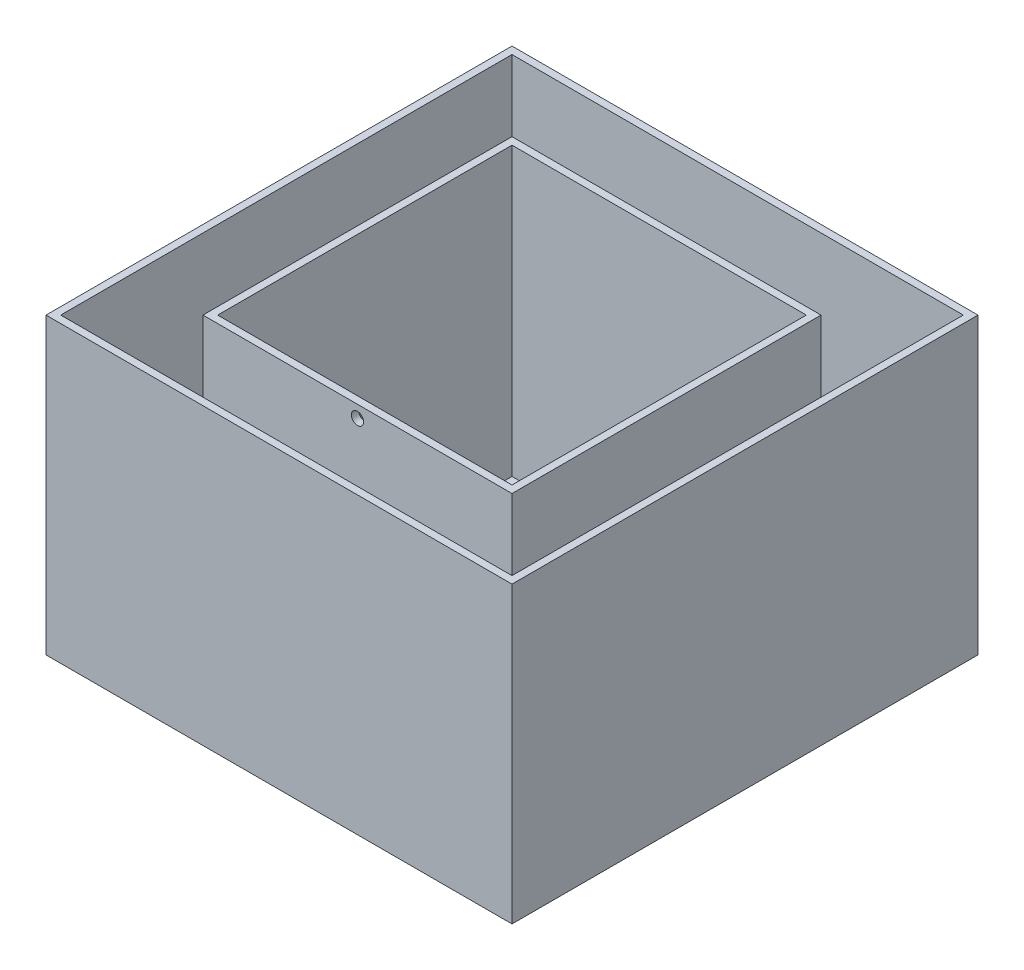
ISO-10303-21;
HEADER;
FILE_DESCRIPTION(('STEP AP214'),'2;1');
FILE_NAME('part.step','',(''),(''),'','','');
FILE_SCHEMA(('AUTOMOTIVE_DESIGN { 1 0 10303 214 1 1 1 1 }'));
ENDSEC;
DATA;
#1=APPLICATION_CONTEXT('core data for automotive mechanical design processes');
#2=APPLICATION_PROTOCOL_DEFINITION('international standard','automotive_design',2000,#1);
#3=PRODUCT_CONTEXT('',#1,'mechanical');
#4=PRODUCT('Part','Part','',(#3));
#5=PRODUCT_RELATED_PRODUCT_CATEGORY('part','',(#4));
#6=PRODUCT_DEFINITION_FORMATION('','',#4);
#7=PRODUCT_DEFINITION_CONTEXT('part definition',#1,'design');
#8=PRODUCT_DEFINITION('design','',#6,#7);
#9=PRODUCT_DEFINITION_SHAPE('','',#8);
#10=(LENGTH_UNIT() NAMED_UNIT(*) SI_UNIT(.MILLI.,.METRE.));
#11=(NAMED_UNIT(*) PLANE_ANGLE_UNIT() SI_UNIT($,.RADIAN.));
#12=(NAMED_UNIT(*) SI_UNIT($,.STERADIAN.) SOLID_ANGLE_UNIT());
#13=UNCERTAINTY_MEASURE_WITH_UNIT(LENGTH_MEASURE(1.E-05),#10,'distance_accuracy_value','');
#14=(GEOMETRIC_REPRESENTATION_CONTEXT(3) GLOBAL_UNCERTAINTY_ASSIGNED_CONTEXT((#13)) GLOBAL_UNIT_ASSIGNED_CONTEXT((#10,
#11,#12)) REPRESENTATION_CONTEXT('',''));
#15=CARTESIAN_POINT('',(0.,0.,0.));
#16=DIRECTION('',(0.,0.,1.));
#17=DIRECTION('',(1.,0.,0.));
#18=AXIS2_PLACEMENT_3D('',#15,#16,#17);
#19=CARTESIAN_POINT('',(0.,4.99999999999999,0.));
#20=DIRECTION('',(0.,-1.,0.));
#21=DIRECTION('',(0.,0.,-1.));
#22=AXIS2_PLACEMENT_3D('',#19,#20,#21);
#23=PLANE('',#22);
#24=DIRECTION('',(0.,0.,1.));
#25=VECTOR('',#24,1.);
#26=CARTESIAN_POINT('',(-92.,4.99999999999999,92.));
#27=LINE('',#26,#25);
#28=CARTESIAN_POINT('',(-92.,4.99999999999999,-92.));
#29=VERTEX_POINT('',#28);
#30=CARTESIAN_POINT('',(-92.,4.99999999999999,92.));
#31=VERTEX_POINT('',#30);
#32=EDGE_CURVE('E258',#29,#31,#27,.T.);
#33=ORIENTED_EDGE('',*,*,#32,.T.);
#34=DIRECTION('',(1.,0.,0.));
#35=VECTOR('',#34,1.);
#36=CARTESIAN_POINT('',(-92.,4.99999999999999,92.));
#37=LINE('',#36,#35);
#38=CARTESIAN_POINT('',(92.,4.99999999999999,92.));
#39=VERTEX_POINT('',#38);
#40=EDGE_CURVE('E261',#31,#39,#37,.T.);
#41=ORIENTED_EDGE('',*,*,#40,.T.);
#42=DIRECTION('',(0.,0.,-1.));
#43=VECTOR('',#42,1.);
#44=CARTESIAN_POINT('',(92.,4.99999999999999,92.));
#45=LINE('',#44,#43);
#46=CARTESIAN_POINT('',(92.,4.99999999999999,-92.));
#47=VERTEX_POINT('',#46);
#48=EDGE_CURVE('E265',#39,#47,#45,.T.);
#49=ORIENTED_EDGE('',*,*,#48,.T.);
#50=DIRECTION('',(-1.,0.,0.));
#51=VECTOR('',#50,1.);
#52=CARTESIAN_POINT('',(-92.,4.99999999999999,-92.));
#53=LINE('',#52,#51);
#54=EDGE_CURVE('E268',#47,#29,#53,.T.);
#55=ORIENTED_EDGE('',*,*,#54,.T.);
#56=EDGE_LOOP('',(#33,#41,#49,#55));
#57=FACE_BOUND('',#56,.T.);
#58=DIRECTION('',(-0.707106781186547,0.,0.707106781186548));
#59=VECTOR('',#58,1.);
#60=CARTESIAN_POINT('',(63.,4.99999999999999,-63.));
#61=LINE('',#60,#59);
#62=CARTESIAN_POINT('',(89.,4.99999999999999,-89.0000000000001));
#63=VERTEX_POINT('',#62);
#64=CARTESIAN_POINT('',(63.,4.99999999999999,-63.));
#65=VERTEX_POINT('',#64);
#66=EDGE_CURVE('E189',#63,#65,#61,.T.);
#67=ORIENTED_EDGE('',*,*,#66,.F.);
#68=DIRECTION('',(0.,0.,-1.));
#69=VECTOR('',#68,1.);
#70=CARTESIAN_POINT('',(89.0000000000001,4.99999999999999,89.0000000000009));
#71=LINE('',#70,#69);
#72=CARTESIAN_POINT('',(89.0000000000001,4.99999999999999,89.0000000000009));
#73=VERTEX_POINT('',#72);
#74=EDGE_CURVE('E198',#73,#63,#71,.T.);
#75=ORIENTED_EDGE('',*,*,#74,.F.);
#76=DIRECTION('',(0.707106781186535,0.,0.70710678118656));
#77=VECTOR('',#76,1.);
#78=CARTESIAN_POINT('',(89.0000000000001,4.99999999999999,89.0000000000009));
#79=LINE('',#78,#77);
#80=CARTESIAN_POINT('',(63.,4.99999999999999,63.));
#81=VERTEX_POINT('',#80);
#82=EDGE_CURVE('E195',#81,#73,#79,.T.);
#83=ORIENTED_EDGE('',*,*,#82,.F.);
#84=DIRECTION('',(1.,0.,0.));
#85=VECTOR('',#84,1.);
#86=CARTESIAN_POINT('',(-63.,4.99999999999999,63.));
#87=LINE('',#86,#85);
#88=CARTESIAN_POINT('',(-63.,4.99999999999999,63.));
#89=VERTEX_POINT('',#88);
#90=EDGE_CURVE('E234',#89,#81,#87,.T.);
#91=ORIENTED_EDGE('',*,*,#90,.F.);
#92=DIRECTION('',(0.707106781186535,0.,-0.70710678118656));
#93=VECTOR('',#92,1.);
#94=CARTESIAN_POINT('',(-89.,4.99999999999999,89.0000000000009));
#95=LINE('',#94,#93);
#96=CARTESIAN_POINT('',(-89.,4.99999999999999,89.0000000000009));
#97=VERTEX_POINT('',#96);
#98=EDGE_CURVE('E205',#97,#89,#95,.T.);
#99=ORIENTED_EDGE('',*,*,#98,.F.);
#100=DIRECTION('',(0.,0.,1.));
#101=VECTOR('',#100,1.);
#102=CARTESIAN_POINT('',(-89.,4.99999999999999,89.0000000000009));
#103=LINE('',#102,#101);
#104=CARTESIAN_POINT('',(-89.,4.99999999999999,-89.));
#105=VERTEX_POINT('',#104);
#106=EDGE_CURVE('E221',#105,#97,#103,.T.);
#107=ORIENTED_EDGE('',*,*,#106,.F.);
#108=DIRECTION('',(-0.707106781186547,0.,-0.707106781186548));
#109=VECTOR('',#108,1.);
#110=CARTESIAN_POINT('',(-63.,4.99999999999999,-63.));
#111=LINE('',#110,#109);
#112=CARTESIAN_POINT('',(-63.,4.99999999999999,-63.));
#113=VERTEX_POINT('',#112);
#114=EDGE_CURVE('E53',#113,#105,#111,.T.);
#115=ORIENTED_EDGE('',*,*,#114,.F.);
#116=DIRECTION('',(-1.,0.,0.));
#117=VECTOR('',#116,1.);
#118=CARTESIAN_POINT('',(-63.,4.99999999999999,-63.));
#119=LINE('',#118,#117);
#120=EDGE_CURVE('E209',#65,#113,#119,.T.);
#121=ORIENTED_EDGE('',*,*,#120,.F.);
#122=EDGE_LOOP('',(#67,#75,#83,#91,#99,#107,#115,#121));
#123=FACE_BOUND('',#122,.T.);
#124=ADVANCED_FACE('F37',(#57,#123),#23,.F.);
#125=CARTESIAN_POINT('',(-95.,120.,95.));
#126=DIRECTION('',(-1.,0.,0.));
#127=DIRECTION('',(0.,0.,1.));
#128=AXIS2_PLACEMENT_3D('',#125,#126,#127);
#129=PLANE('',#128);
#130=DIRECTION('',(0.,0.,-1.));
#131=VECTOR('',#130,1.);
#132=CARTESIAN_POINT('',(-95.,0.,95.));
#133=LINE('',#132,#131);
#134=CARTESIAN_POINT('',(-95.,0.,95.));
#135=VERTEX_POINT('',#134);
#136=CARTESIAN_POINT('',(-95.,0.,-95.));
#137=VERTEX_POINT('',#136);
#138=EDGE_CURVE('E315',#135,#137,#133,.T.);
#139=ORIENTED_EDGE('',*,*,#138,.F.);
#140=DIRECTION('',(0.,-1.,0.));
#141=VECTOR('',#140,1.);
#142=CARTESIAN_POINT('',(-95.,120.,95.));
#143=LINE('',#142,#141);
#144=CARTESIAN_POINT('',(-95.,120.,95.));
#145=VERTEX_POINT('',#144);
#146=EDGE_CURVE('E343',#145,#135,#143,.T.);
#147=ORIENTED_EDGE('',*,*,#146,.F.);
#148=DIRECTION('',(0.,0.,-1.));
#149=VECTOR('',#148,1.);
#150=CARTESIAN_POINT('',(-95.,120.,95.));
#151=LINE('',#150,#149);
#152=CARTESIAN_POINT('',(-95.,120.,-95.));
#153=VERTEX_POINT('',#152);
#154=EDGE_CURVE('E322',#145,#153,#151,.T.);
#155=ORIENTED_EDGE('',*,*,#154,.T.);
#156=DIRECTION('',(0.,-1.,0.));
#157=VECTOR('',#156,1.);
#158=CARTESIAN_POINT('',(-95.,120.,-95.));
#159=LINE('',#158,#157);
#160=EDGE_CURVE('E333',#153,#137,#159,.T.);
#161=ORIENTED_EDGE('',*,*,#160,.T.);
#162=EDGE_LOOP('',(#139,#147,#155,#161));
#163=FACE_BOUND('',#162,.T.);
#164=ADVANCED_FACE('F39',(#163),#129,.T.);
#165=CARTESIAN_POINT('',(-95.,120.,95.));
#166=DIRECTION('',(0.,0.,-1.));
#167=DIRECTION('',(-1.,0.,0.));
#168=AXIS2_PLACEMENT_3D('',#165,#166,#167);
#169=PLANE('',#168);
#170=DIRECTION('',(1.,0.,0.));
#171=VECTOR('',#170,1.);
#172=CARTESIAN_POINT('',(-95.,0.,95.));
#173=LINE('',#172,#171);
#174=CARTESIAN_POINT('',(95.,0.,95.));
#175=VERTEX_POINT('',#174);
#176=EDGE_CURVE('E326',#135,#175,#173,.T.);
#177=ORIENTED_EDGE('',*,*,#176,.T.);
#178=DIRECTION('',(0.,-1.,0.));
#179=VECTOR('',#178,1.);
#180=CARTESIAN_POINT('',(95.,120.,95.));
#181=LINE('',#180,#179);
#182=CARTESIAN_POINT('',(95.,120.,95.));
#183=VERTEX_POINT('',#182);
#184=EDGE_CURVE('E346',#183,#175,#181,.T.);
#185=ORIENTED_EDGE('',*,*,#184,.F.);
#186=DIRECTION('',(1.,0.,0.));
#187=VECTOR('',#186,1.);
#188=CARTESIAN_POINT('',(-95.,120.,95.));
#189=LINE('',#188,#187);
#190=EDGE_CURVE('E331',#145,#183,#189,.T.);
#191=ORIENTED_EDGE('',*,*,#190,.F.);
#192=ORIENTED_EDGE('',*,*,#146,.T.);
#193=EDGE_LOOP('',(#177,#185,#191,#192));
#194=FACE_BOUND('',#193,.T.);
#195=ADVANCED_FACE('F399',(#194),#169,.F.);
#196=CARTESIAN_POINT('',(95.,120.,95.));
#197=DIRECTION('',(-1.,0.,0.));
#198=DIRECTION('',(0.,0.,1.));
#199=AXIS2_PLACEMENT_3D('',#196,#197,#198);
#200=PLANE('',#199);
#201=DIRECTION('',(0.,0.,-1.));
#202=VECTOR('',#201,1.);
#203=CARTESIAN_POINT('',(95.,0.,95.));
#204=LINE('',#203,#202);
#205=CARTESIAN_POINT('',(95.,0.,-95.));
#206=VERTEX_POINT('',#205);
#207=EDGE_CURVE('E339',#175,#206,#204,.T.);
#208=ORIENTED_EDGE('',*,*,#207,.T.);
#209=DIRECTION('',(0.,-1.,0.));
#210=VECTOR('',#209,1.);
#211=CARTESIAN_POINT('',(95.,120.,-95.));
#212=LINE('',#211,#210);
#213=CARTESIAN_POINT('',(95.,120.,-95.));
#214=VERTEX_POINT('',#213);
#215=EDGE_CURVE('E349',#214,#206,#212,.T.);
#216=ORIENTED_EDGE('',*,*,#215,.F.);
#217=DIRECTION('',(0.,0.,-1.));
#218=VECTOR('',#217,1.);
#219=CARTESIAN_POINT('',(95.,120.,95.));
#220=LINE('',#219,#218);
#221=EDGE_CURVE('E329',#183,#214,#220,.T.);
#222=ORIENTED_EDGE('',*,*,#221,.F.);
#223=ORIENTED_EDGE('',*,*,#184,.T.);
#224=EDGE_LOOP('',(#208,#216,#222,#223));
#225=FACE_BOUND('',#224,.T.);
#226=ADVANCED_FACE('F396',(#225),#200,.F.);
#227=CARTESIAN_POINT('',(-95.,120.,-95.));
#228=DIRECTION('',(0.,0.,-1.));
#229=DIRECTION('',(-1.,0.,0.));
#230=AXIS2_PLACEMENT_3D('',#227,#228,#229);
#231=PLANE('',#230);
#232=DIRECTION('',(1.,0.,0.));
#233=VECTOR('',#232,1.);
#234=CARTESIAN_POINT('',(-95.,0.,-95.));
#235=LINE('',#234,#233);
#236=EDGE_CURVE('E336',#137,#206,#235,.T.);
#237=ORIENTED_EDGE('',*,*,#236,.F.);
#238=ORIENTED_EDGE('',*,*,#160,.F.);
#239=DIRECTION('',(1.,0.,0.));
#240=VECTOR('',#239,1.);
#241=CARTESIAN_POINT('',(-95.,120.,-95.));
#242=LINE('',#241,#240);
#243=EDGE_CURVE('E325',#153,#214,#242,.T.);
#244=ORIENTED_EDGE('',*,*,#243,.T.);
#245=ORIENTED_EDGE('',*,*,#215,.T.);
#246=EDGE_LOOP('',(#237,#238,#244,#245));
#247=FACE_BOUND('',#246,.T.);
#248=ADVANCED_FACE('F392',(#247),#231,.T.);
#249=CARTESIAN_POINT('',(0.,120.,0.));
#250=DIRECTION('',(0.,-1.,0.));
#251=DIRECTION('',(0.,0.,-1.));
#252=AXIS2_PLACEMENT_3D('',#249,#250,#251);
#253=PLANE('',#252);
#254=DIRECTION('',(1.,0.,0.));
#255=VECTOR('',#254,1.);
#256=CARTESIAN_POINT('',(-92.,120.,92.));
#257=LINE('',#256,#255);
#258=CARTESIAN_POINT('',(-92.,120.,92.));
#259=VERTEX_POINT('',#258);
#260=CARTESIAN_POINT('',(92.,120.,92.));
#261=VERTEX_POINT('',#260);
#262=EDGE_CURVE('E273',#259,#261,#257,.T.);
#263=ORIENTED_EDGE('',*,*,#262,.F.);
#264=DIRECTION('',(0.,0.,1.));
#265=VECTOR('',#264,1.);
#266=CARTESIAN_POINT('',(-92.,120.,92.));
#267=LINE('',#266,#265);
#268=CARTESIAN_POINT('',(-92.,120.,-92.));
#269=VERTEX_POINT('',#268);
#270=EDGE_CURVE('E251',#269,#259,#267,.T.);
#271=ORIENTED_EDGE('',*,*,#270,.F.);
#272=DIRECTION('',(-1.,0.,0.));
#273=VECTOR('',#272,1.);
#274=CARTESIAN_POINT('',(-92.,120.,-92.));
#275=LINE('',#274,#273);
#276=CARTESIAN_POINT('',(92.,120.,-92.));
#277=VERTEX_POINT('',#276);
#278=EDGE_CURVE('E262',#277,#269,#275,.T.);
#279=ORIENTED_EDGE('',*,*,#278,.F.);
#280=DIRECTION('',(0.,0.,-1.));
#281=VECTOR('',#280,1.);
#282=CARTESIAN_POINT('',(92.,120.,92.));
#283=LINE('',#282,#281);
#284=EDGE_CURVE('E276',#261,#277,#283,.T.);
#285=ORIENTED_EDGE('',*,*,#284,.F.);
#286=EDGE_LOOP('',(#263,#271,#279,#285));
#287=FACE_BOUND('',#286,.T.);
#288=ORIENTED_EDGE('',*,*,#154,.F.);
#289=ORIENTED_EDGE('',*,*,#190,.T.);
#290=ORIENTED_EDGE('',*,*,#221,.T.);
#291=ORIENTED_EDGE('',*,*,#243,.F.);
#292=EDGE_LOOP('',(#288,#289,#290,#291));
#293=FACE_BOUND('',#292,.T.);
#294=ADVANCED_FACE('F377',(#287,#293),#253,.F.);
#295=CARTESIAN_POINT('',(0.,0.,0.));
#296=DIRECTION('',(0.,-1.,0.));
#297=DIRECTION('',(0.,0.,-1.));
#298=AXIS2_PLACEMENT_3D('',#295,#296,#297);
#299=PLANE('',#298);
#300=DIRECTION('',(0.,0.,1.));
#301=VECTOR('',#300,1.);
#302=CARTESIAN_POINT('',(89.,0.,0.));
#303=LINE('',#302,#301);
#304=CARTESIAN_POINT('',(89.,0.,-89.0000000000001));
#305=VERTEX_POINT('',#304);
#306=CARTESIAN_POINT('',(89.0000000000001,0.,89.0000000000009));
#307=VERTEX_POINT('',#306);
#308=EDGE_CURVE('E11',#305,#307,#303,.T.);
#309=ORIENTED_EDGE('',*,*,#308,.F.);
#310=DIRECTION('',(0.707106781186547,0.,-0.707106781186548));
#311=VECTOR('',#310,1.);
#312=CARTESIAN_POINT('',(0.,0.,0.));
#313=LINE('',#312,#311);
#314=CARTESIAN_POINT('',(63.,0.,-63.));
#315=VERTEX_POINT('',#314);
#316=EDGE_CURVE('E192',#315,#305,#313,.T.);
#317=ORIENTED_EDGE('',*,*,#316,.F.);
#318=DIRECTION('',(0.,0.,-1.));
#319=VECTOR('',#318,1.);
#320=CARTESIAN_POINT('',(63.,0.,0.));
#321=LINE('',#320,#319);
#322=CARTESIAN_POINT('',(63.0000000000001,0.,63.));
#323=VERTEX_POINT('',#322);
#324=EDGE_CURVE('E361',#323,#315,#321,.T.);
#325=ORIENTED_EDGE('',*,*,#324,.F.);
#326=DIRECTION('',(-0.707106781186535,0.,-0.70710678118656));
#327=VECTOR('',#326,1.);
#328=CARTESIAN_POINT('',(1.1579431882793E-12,0.,-1.15794318827926E-12));
#329=LINE('',#328,#327);
#330=EDGE_CURVE('E46',#307,#323,#329,.T.);
#331=ORIENTED_EDGE('',*,*,#330,.F.);
#332=EDGE_LOOP('',(#309,#317,#325,#331));
#333=FACE_BOUND('',#332,.T.);
#334=DIRECTION('',(-0.707106781186535,0.,0.70710678118656));
#335=VECTOR('',#334,1.);
#336=CARTESIAN_POINT('',(-1.12850395467898E-12,0.,-1.12850395467894E-12));
#337=LINE('',#336,#335);
#338=CARTESIAN_POINT('',(-63.,0.,63.));
#339=VERTEX_POINT('',#338);
#340=CARTESIAN_POINT('',(-89.,0.,89.0000000000009));
#341=VERTEX_POINT('',#340);
#342=EDGE_CURVE('E358',#339,#341,#337,.T.);
#343=ORIENTED_EDGE('',*,*,#342,.F.);
#344=DIRECTION('',(0.,0.,1.));
#345=VECTOR('',#344,1.);
#346=CARTESIAN_POINT('',(-63.,0.,0.));
#347=LINE('',#346,#345);
#348=CARTESIAN_POINT('',(-63.,0.,-63.));
#349=VERTEX_POINT('',#348);
#350=EDGE_CURVE('E345',#349,#339,#347,.T.);
#351=ORIENTED_EDGE('',*,*,#350,.F.);
#352=DIRECTION('',(0.707106781186547,0.,0.707106781186548));
#353=VECTOR('',#352,1.);
#354=CARTESIAN_POINT('',(0.,0.,0.));
#355=LINE('',#354,#353);
#356=CARTESIAN_POINT('',(-89.,0.,-89.));
#357=VERTEX_POINT('',#356);
#358=EDGE_CURVE('E353',#357,#349,#355,.T.);
#359=ORIENTED_EDGE('',*,*,#358,.F.);
#360=DIRECTION('',(0.,0.,-1.));
#361=VECTOR('',#360,1.);
#362=CARTESIAN_POINT('',(-89.,0.,0.));
#363=LINE('',#362,#361);
#364=EDGE_CURVE('E356',#341,#357,#363,.T.);
#365=ORIENTED_EDGE('',*,*,#364,.F.);
#366=EDGE_LOOP('',(#343,#351,#359,#365));
#367=FACE_BOUND('',#366,.T.);
#368=ORIENTED_EDGE('',*,*,#138,.T.);
#369=ORIENTED_EDGE('',*,*,#236,.T.);
#370=ORIENTED_EDGE('',*,*,#207,.F.);
#371=ORIENTED_EDGE('',*,*,#176,.F.);
#372=EDGE_LOOP('',(#368,#369,#370,#371));
#373=FACE_BOUND('',#372,.T.);
#374=ADVANCED_FACE('F373',(#333,#367,#373),#299,.T.);
#375=CARTESIAN_POINT('',(-92.,4.99999999999999,92.));
#376=DIRECTION('',(-1.,0.,0.));
#377=DIRECTION('',(0.,0.,1.));
#378=AXIS2_PLACEMENT_3D('',#375,#376,#377);
#379=PLANE('',#378);
#380=ORIENTED_EDGE('',*,*,#270,.T.);
#381=DIRECTION('',(0.,1.,0.));
#382=VECTOR('',#381,1.);
#383=CARTESIAN_POINT('',(-92.,4.99999999999999,92.));
#384=LINE('',#383,#382);
#385=EDGE_CURVE('E271',#31,#259,#384,.T.);
#386=ORIENTED_EDGE('',*,*,#385,.F.);
#387=ORIENTED_EDGE('',*,*,#32,.F.);
#388=DIRECTION('',(0.,1.,0.));
#389=VECTOR('',#388,1.);
#390=CARTESIAN_POINT('',(-92.,4.99999999999999,-92.));
#391=LINE('',#390,#389);
#392=EDGE_CURVE('E281',#29,#269,#391,.T.);
#393=ORIENTED_EDGE('',*,*,#392,.T.);
#394=EDGE_LOOP('',(#380,#386,#387,#393));
#395=FACE_BOUND('',#394,.T.);
#396=ADVANCED_FACE('F376',(#395),#379,.F.);
#397=CARTESIAN_POINT('',(-92.,4.99999999999999,-92.));
#398=DIRECTION('',(0.,0.,-1.));
#399=DIRECTION('',(-1.,0.,0.));
#400=AXIS2_PLACEMENT_3D('',#397,#398,#399);
#401=PLANE('',#400);
#402=ORIENTED_EDGE('',*,*,#278,.T.);
#403=ORIENTED_EDGE('',*,*,#392,.F.);
#404=ORIENTED_EDGE('',*,*,#54,.F.);
#405=DIRECTION('',(0.,1.,0.));
#406=VECTOR('',#405,1.);
#407=CARTESIAN_POINT('',(92.,4.99999999999999,-92.));
#408=LINE('',#407,#406);
#409=EDGE_CURVE('E284',#47,#277,#408,.T.);
#410=ORIENTED_EDGE('',*,*,#409,.T.);
#411=EDGE_LOOP('',(#402,#403,#404,#410));
#412=FACE_BOUND('',#411,.T.);
#413=ADVANCED_FACE('F423',(#412),#401,.F.);
#414=CARTESIAN_POINT('',(92.,4.99999999999999,92.));
#415=DIRECTION('',(1.,0.,0.));
#416=DIRECTION('',(0.,0.,-1.));
#417=AXIS2_PLACEMENT_3D('',#414,#415,#416);
#418=PLANE('',#417);
#419=ORIENTED_EDGE('',*,*,#284,.T.);
#420=ORIENTED_EDGE('',*,*,#409,.F.);
#421=ORIENTED_EDGE('',*,*,#48,.F.);
#422=DIRECTION('',(0.,1.,0.));
#423=VECTOR('',#422,1.);
#424=CARTESIAN_POINT('',(92.,4.99999999999999,92.));
#425=LINE('',#424,#423);
#426=EDGE_CURVE('E286',#39,#261,#425,.T.);
#427=ORIENTED_EDGE('',*,*,#426,.T.);
#428=EDGE_LOOP('',(#419,#420,#421,#427));
#429=FACE_BOUND('',#428,.T.);
#430=ADVANCED_FACE('F426',(#429),#418,.F.);
#431=CARTESIAN_POINT('',(-92.,4.99999999999999,92.));
#432=DIRECTION('',(0.,0.,1.));
#433=DIRECTION('',(1.,0.,0.));
#434=AXIS2_PLACEMENT_3D('',#431,#432,#433);
#435=PLANE('',#434);
#436=ORIENTED_EDGE('',*,*,#262,.T.);
#437=ORIENTED_EDGE('',*,*,#426,.F.);
#438=ORIENTED_EDGE('',*,*,#40,.F.);
#439=ORIENTED_EDGE('',*,*,#385,.T.);
#440=EDGE_LOOP('',(#436,#437,#438,#439));
#441=FACE_BOUND('',#440,.T.);
#442=ADVANCED_FACE('F430',(#441),#435,.F.);
#443=CARTESIAN_POINT('',(63.,4.99999999999999,63.));
#444=DIRECTION('',(1.,0.,0.));
#445=DIRECTION('',(0.,0.,-1.));
#446=AXIS2_PLACEMENT_3D('',#443,#444,#445);
#447=PLANE('',#446);
#448=DIRECTION('',(0.,0.,-1.));
#449=VECTOR('',#448,1.);
#450=CARTESIAN_POINT('',(63.,120.,63.));
#451=LINE('',#450,#449);
#452=CARTESIAN_POINT('',(63.,120.,63.));
#453=VERTEX_POINT('',#452);
#454=CARTESIAN_POINT('',(63.,120.,-63.));
#455=VERTEX_POINT('',#454);
#456=EDGE_CURVE('E215',#453,#455,#451,.T.);
#457=ORIENTED_EDGE('',*,*,#456,.F.);
#458=DIRECTION('',(0.,1.,0.));
#459=VECTOR('',#458,1.);
#460=CARTESIAN_POINT('',(63.,4.99999999999999,63.));
#461=LINE('',#460,#459);
#462=EDGE_CURVE('E249',#81,#453,#461,.T.);
#463=ORIENTED_EDGE('',*,*,#462,.F.);
#464=DIRECTION('',(0.,1.,0.));
#465=VECTOR('',#464,1.);
#466=CARTESIAN_POINT('',(63.0000000000001,-48.,63.));
#467=LINE('',#466,#465);
#468=EDGE_CURVE('E216',#323,#81,#467,.T.);
#469=ORIENTED_EDGE('',*,*,#468,.F.);
#470=ORIENTED_EDGE('',*,*,#324,.T.);
#471=DIRECTION('',(0.,1.,0.));
#472=VECTOR('',#471,1.);
#473=CARTESIAN_POINT('',(63.,-48.,-63.));
#474=LINE('',#473,#472);
#475=EDGE_CURVE('E61',#315,#65,#474,.T.);
#476=ORIENTED_EDGE('',*,*,#475,.T.);
#477=DIRECTION('',(0.,1.,0.));
#478=VECTOR('',#477,1.);
#479=CARTESIAN_POINT('',(63.,4.99999999999999,-63.));
#480=LINE('',#479,#478);
#481=EDGE_CURVE('E238',#65,#455,#480,.T.);
#482=ORIENTED_EDGE('',*,*,#481,.T.);
#483=EDGE_LOOP('',(#457,#463,#469,#470,#476,#482));
#484=FACE_BOUND('',#483,.T.);
#485=ADVANCED_FACE('F372',(#484),#447,.T.);
#486=CARTESIAN_POINT('',(-63.,4.99999999999999,63.));
#487=DIRECTION('',(0.,0.,1.));
#488=DIRECTION('',(1.,0.,0.));
#489=AXIS2_PLACEMENT_3D('',#486,#487,#488);
#490=PLANE('',#489);
#491=CARTESIAN_POINT('',(0.,115.,63.));
#492=DIRECTION('',(0.,0.,1.));
#493=DIRECTION('',(1.,0.,0.));
#494=AXIS2_PLACEMENT_3D('',#491,#492,#493);
#495=CIRCLE('',#494,2.5);
#496=CARTESIAN_POINT('',(2.5,115.,63.));
#497=VERTEX_POINT('',#496);
#498=EDGE_CURVE('E741',#497,#497,#495,.T.);
#499=ORIENTED_EDGE('',*,*,#498,.F.);
#500=EDGE_LOOP('',(#499));
#501=FACE_BOUND('',#500,.T.);
#502=DIRECTION('',(1.,0.,0.));
#503=VECTOR('',#502,1.);
#504=CARTESIAN_POINT('',(-63.,120.,63.));
#505=LINE('',#504,#503);
#506=CARTESIAN_POINT('',(-63.,120.,63.));
#507=VERTEX_POINT('',#506);
#508=EDGE_CURVE('E235',#507,#453,#505,.T.);
#509=ORIENTED_EDGE('',*,*,#508,.F.);
#510=DIRECTION('',(0.,1.,0.));
#511=VECTOR('',#510,1.);
#512=CARTESIAN_POINT('',(-63.,4.99999999999999,63.));
#513=LINE('',#512,#511);
#514=EDGE_CURVE('E252',#89,#507,#513,.T.);
#515=ORIENTED_EDGE('',*,*,#514,.F.);
#516=ORIENTED_EDGE('',*,*,#90,.T.);
#517=ORIENTED_EDGE('',*,*,#462,.T.);
#518=EDGE_LOOP('',(#509,#515,#516,#517));
#519=FACE_BOUND('',#518,.T.);
#520=ADVANCED_FACE('F479',(#501,#519),#490,.T.);
#521=CARTESIAN_POINT('',(-63.,4.99999999999999,63.));
#522=DIRECTION('',(-1.,0.,0.));
#523=DIRECTION('',(0.,0.,1.));
#524=AXIS2_PLACEMENT_3D('',#521,#522,#523);
#525=PLANE('',#524);
#526=DIRECTION('',(0.,0.,1.));
#527=VECTOR('',#526,1.);
#528=CARTESIAN_POINT('',(-63.,120.,63.));
#529=LINE('',#528,#527);
#530=CARTESIAN_POINT('',(-63.,120.,-63.));
#531=VERTEX_POINT('',#530);
#532=EDGE_CURVE('E244',#531,#507,#529,.T.);
#533=ORIENTED_EDGE('',*,*,#532,.F.);
#534=DIRECTION('',(0.,1.,0.));
#535=VECTOR('',#534,1.);
#536=CARTESIAN_POINT('',(-63.,4.99999999999999,-63.));
#537=LINE('',#536,#535);
#538=EDGE_CURVE('E254',#113,#531,#537,.T.);
#539=ORIENTED_EDGE('',*,*,#538,.F.);
#540=DIRECTION('',(0.,1.,0.));
#541=VECTOR('',#540,1.);
#542=CARTESIAN_POINT('',(-63.,-48.,-63.));
#543=LINE('',#542,#541);
#544=EDGE_CURVE('E222',#349,#113,#543,.T.);
#545=ORIENTED_EDGE('',*,*,#544,.F.);
#546=ORIENTED_EDGE('',*,*,#350,.T.);
#547=DIRECTION('',(0.,1.,0.));
#548=VECTOR('',#547,1.);
#549=CARTESIAN_POINT('',(-63.,-48.,63.));
#550=LINE('',#549,#548);
#551=EDGE_CURVE('E219',#339,#89,#550,.T.);
#552=ORIENTED_EDGE('',*,*,#551,.T.);
#553=ORIENTED_EDGE('',*,*,#514,.T.);
#554=EDGE_LOOP('',(#533,#539,#545,#546,#552,#553));
#555=FACE_BOUND('',#554,.T.);
#556=ADVANCED_FACE('F474',(#555),#525,.T.);
#557=CARTESIAN_POINT('',(-63.,4.99999999999999,-63.));
#558=DIRECTION('',(0.,0.,-1.));
#559=DIRECTION('',(-1.,0.,0.));
#560=AXIS2_PLACEMENT_3D('',#557,#558,#559);
#561=PLANE('',#560);
#562=DIRECTION('',(-1.,0.,0.));
#563=VECTOR('',#562,1.);
#564=CARTESIAN_POINT('',(-63.,120.,-63.));
#565=LINE('',#564,#563);
#566=EDGE_CURVE('E241',#455,#531,#565,.T.);
#567=ORIENTED_EDGE('',*,*,#566,.F.);
#568=ORIENTED_EDGE('',*,*,#481,.F.);
#569=ORIENTED_EDGE('',*,*,#120,.T.);
#570=ORIENTED_EDGE('',*,*,#538,.T.);
#571=EDGE_LOOP('',(#567,#568,#569,#570));
#572=FACE_BOUND('',#571,.T.);
#573=ADVANCED_FACE('F442',(#572),#561,.T.);
#574=CARTESIAN_POINT('',(0.,2.99999999999999,0.));
#575=DIRECTION('',(0.,-1.,0.));
#576=DIRECTION('',(0.,0.,-1.));
#577=AXIS2_PLACEMENT_3D('',#574,#575,#576);
#578=PLANE('',#577);
#579=DIRECTION('',(0.,0.,-1.));
#580=VECTOR('',#579,1.);
#581=CARTESIAN_POINT('',(60.,2.99999999999999,60.));
#582=LINE('',#581,#580);
#583=CARTESIAN_POINT('',(60.,2.99999999999999,60.));
#584=VERTEX_POINT('',#583);
#585=CARTESIAN_POINT('',(60.,2.99999999999999,-60.));
#586=VERTEX_POINT('',#585);
#587=EDGE_CURVE('E290',#584,#586,#582,.T.);
#588=ORIENTED_EDGE('',*,*,#587,.T.);
#589=DIRECTION('',(-1.,0.,0.));
#590=VECTOR('',#589,1.);
#591=CARTESIAN_POINT('',(-60.,2.99999999999999,-60.));
#592=LINE('',#591,#590);
#593=CARTESIAN_POINT('',(-60.,2.99999999999999,-60.));
#594=VERTEX_POINT('',#593);
#595=EDGE_CURVE('E293',#586,#594,#592,.T.);
#596=ORIENTED_EDGE('',*,*,#595,.T.);
#597=DIRECTION('',(0.,0.,1.));
#598=VECTOR('',#597,1.);
#599=CARTESIAN_POINT('',(-60.,2.99999999999999,60.));
#600=LINE('',#599,#598);
#601=CARTESIAN_POINT('',(-60.,2.99999999999999,60.));
#602=VERTEX_POINT('',#601);
#603=EDGE_CURVE('E297',#594,#602,#600,.T.);
#604=ORIENTED_EDGE('',*,*,#603,.T.);
#605=DIRECTION('',(1.,0.,0.));
#606=VECTOR('',#605,1.);
#607=CARTESIAN_POINT('',(-60.,2.99999999999999,60.));
#608=LINE('',#607,#606);
#609=EDGE_CURVE('E300',#602,#584,#608,.T.);
#610=ORIENTED_EDGE('',*,*,#609,.T.);
#611=EDGE_LOOP('',(#588,#596,#604,#610));
#612=FACE_BOUND('',#611,.T.);
#613=ADVANCED_FACE('F438',(#612),#578,.F.);
#614=CARTESIAN_POINT('',(-60.,2.99999999999999,60.));
#615=DIRECTION('',(-1.,0.,0.));
#616=DIRECTION('',(0.,0.,1.));
#617=AXIS2_PLACEMENT_3D('',#614,#615,#616);
#618=PLANE('',#617);
#619=DIRECTION('',(0.,0.,1.));
#620=VECTOR('',#619,1.);
#621=CARTESIAN_POINT('',(-60.,120.,60.));
#622=LINE('',#621,#620);
#623=CARTESIAN_POINT('',(-60.,120.,-60.));
#624=VERTEX_POINT('',#623);
#625=CARTESIAN_POINT('',(-60.,120.,60.));
#626=VERTEX_POINT('',#625);
#627=EDGE_CURVE('E308',#624,#626,#622,.T.);
#628=ORIENTED_EDGE('',*,*,#627,.T.);
#629=DIRECTION('',(0.,1.,0.));
#630=VECTOR('',#629,1.);
#631=CARTESIAN_POINT('',(-60.,2.99999999999999,60.));
#632=LINE('',#631,#630);
#633=EDGE_CURVE('E316',#602,#626,#632,.T.);
#634=ORIENTED_EDGE('',*,*,#633,.F.);
#635=ORIENTED_EDGE('',*,*,#603,.F.);
#636=DIRECTION('',(0.,1.,0.));
#637=VECTOR('',#636,1.);
#638=CARTESIAN_POINT('',(-60.,2.99999999999999,-60.));
#639=LINE('',#638,#637);
#640=EDGE_CURVE('E318',#594,#624,#639,.T.);
#641=ORIENTED_EDGE('',*,*,#640,.T.);
#642=EDGE_LOOP('',(#628,#634,#635,#641));
#643=FACE_BOUND('',#642,.T.);
#644=ADVANCED_FACE('F441',(#643),#618,.F.);
#645=CARTESIAN_POINT('',(-60.,2.99999999999999,60.));
#646=DIRECTION('',(0.,0.,1.));
#647=DIRECTION('',(1.,0.,0.));
#648=AXIS2_PLACEMENT_3D('',#645,#646,#647);
#649=PLANE('',#648);
#650=CARTESIAN_POINT('',(0.,115.,60.));
#651=DIRECTION('',(0.,0.,1.));
#652=DIRECTION('',(1.,0.,0.));
#653=AXIS2_PLACEMENT_3D('',#650,#651,#652);
#654=CIRCLE('',#653,2.5);
#655=CARTESIAN_POINT('',(2.5,115.,60.));
#656=VERTEX_POINT('',#655);
#657=EDGE_CURVE('E41',#656,#656,#654,.T.);
#658=ORIENTED_EDGE('',*,*,#657,.T.);
#659=EDGE_LOOP('',(#658));
#660=FACE_BOUND('',#659,.T.);
#661=DIRECTION('',(1.,0.,0.));
#662=VECTOR('',#661,1.);
#663=CARTESIAN_POINT('',(-60.,120.,60.));
#664=LINE('',#663,#662);
#665=CARTESIAN_POINT('',(60.,120.,60.));
#666=VERTEX_POINT('',#665);
#667=EDGE_CURVE('E294',#626,#666,#664,.T.);
#668=ORIENTED_EDGE('',*,*,#667,.T.);
#669=DIRECTION('',(0.,1.,0.));
#670=VECTOR('',#669,1.);
#671=CARTESIAN_POINT('',(60.,2.99999999999999,60.));
#672=LINE('',#671,#670);
#673=EDGE_CURVE('E313',#584,#666,#672,.T.);
#674=ORIENTED_EDGE('',*,*,#673,.F.);
#675=ORIENTED_EDGE('',*,*,#609,.F.);
#676=ORIENTED_EDGE('',*,*,#633,.T.);
#677=EDGE_LOOP('',(#668,#674,#675,#676));
#678=FACE_BOUND('',#677,.T.);
#679=ADVANCED_FACE('F444',(#660,#678),#649,.F.);
#680=CARTESIAN_POINT('',(60.,2.99999999999999,60.));
#681=DIRECTION('',(1.,0.,0.));
#682=DIRECTION('',(0.,0.,-1.));
#683=AXIS2_PLACEMENT_3D('',#680,#681,#682);
#684=PLANE('',#683);
#685=DIRECTION('',(0.,0.,-1.));
#686=VECTOR('',#685,1.);
#687=CARTESIAN_POINT('',(60.,120.,60.));
#688=LINE('',#687,#686);
#689=CARTESIAN_POINT('',(60.,120.,-60.));
#690=VERTEX_POINT('',#689);
#691=EDGE_CURVE('E283',#666,#690,#688,.T.);
#692=ORIENTED_EDGE('',*,*,#691,.T.);
#693=DIRECTION('',(0.,1.,0.));
#694=VECTOR('',#693,1.);
#695=CARTESIAN_POINT('',(60.,2.99999999999999,-60.));
#696=LINE('',#695,#694);
#697=EDGE_CURVE('E303',#586,#690,#696,.T.);
#698=ORIENTED_EDGE('',*,*,#697,.F.);
#699=ORIENTED_EDGE('',*,*,#587,.F.);
#700=ORIENTED_EDGE('',*,*,#673,.T.);
#701=EDGE_LOOP('',(#692,#698,#699,#700));
#702=FACE_BOUND('',#701,.T.);
#703=ADVANCED_FACE('F447',(#702),#684,.F.);
#704=CARTESIAN_POINT('',(-60.,2.99999999999999,-60.));
#705=DIRECTION('',(0.,0.,-1.));
#706=DIRECTION('',(-1.,0.,0.));
#707=AXIS2_PLACEMENT_3D('',#704,#705,#706);
#708=PLANE('',#707);
#709=DIRECTION('',(-1.,0.,0.));
#710=VECTOR('',#709,1.);
#711=CARTESIAN_POINT('',(-60.,120.,-60.));
#712=LINE('',#711,#710);
#713=EDGE_CURVE('E305',#690,#624,#712,.T.);
#714=ORIENTED_EDGE('',*,*,#713,.T.);
#715=ORIENTED_EDGE('',*,*,#640,.F.);
#716=ORIENTED_EDGE('',*,*,#595,.F.);
#717=ORIENTED_EDGE('',*,*,#697,.T.);
#718=EDGE_LOOP('',(#714,#715,#716,#717));
#719=FACE_BOUND('',#718,.T.);
#720=ADVANCED_FACE('F412',(#719),#708,.F.);
#721=ORIENTED_EDGE('',*,*,#713,.F.);
#722=ORIENTED_EDGE('',*,*,#691,.F.);
#723=ORIENTED_EDGE('',*,*,#667,.F.);
#724=ORIENTED_EDGE('',*,*,#627,.F.);
#725=EDGE_LOOP('',(#721,#722,#723,#724));
#726=FACE_BOUND('',#725,.T.);
#727=ORIENTED_EDGE('',*,*,#456,.T.);
#728=ORIENTED_EDGE('',*,*,#566,.T.);
#729=ORIENTED_EDGE('',*,*,#532,.T.);
#730=ORIENTED_EDGE('',*,*,#508,.T.);
#731=EDGE_LOOP('',(#727,#728,#729,#730));
#732=FACE_BOUND('',#731,.T.);
#733=ADVANCED_FACE('F404',(#726,#732),#253,.F.);
#734=CARTESIAN_POINT('',(-89.,-48.,89.0000000000009));
#735=DIRECTION('',(0.70710678118656,0.,0.707106781186535));
#736=DIRECTION('',(0.707106781186535,0.,-0.70710678118656));
#737=AXIS2_PLACEMENT_3D('',#734,#735,#736);
#738=PLANE('',#737);
#739=ORIENTED_EDGE('',*,*,#342,.T.);
#740=DIRECTION('',(0.,1.,0.));
#741=VECTOR('',#740,1.);
#742=CARTESIAN_POINT('',(-89.,-48.,89.0000000000009));
#743=LINE('',#742,#741);
#744=EDGE_CURVE('E226',#341,#97,#743,.T.);
#745=ORIENTED_EDGE('',*,*,#744,.T.);
#746=ORIENTED_EDGE('',*,*,#98,.T.);
#747=ORIENTED_EDGE('',*,*,#551,.F.);
#748=EDGE_LOOP('',(#739,#745,#746,#747));
#749=FACE_BOUND('',#748,.T.);
#750=ADVANCED_FACE('F411',(#749),#738,.F.);
#751=CARTESIAN_POINT('',(-89.,-48.,89.0000000000009));
#752=DIRECTION('',(-1.,0.,0.));
#753=DIRECTION('',(0.,0.,1.));
#754=AXIS2_PLACEMENT_3D('',#751,#752,#753);
#755=PLANE('',#754);
#756=ORIENTED_EDGE('',*,*,#364,.T.);
#757=DIRECTION('',(0.,1.,0.));
#758=VECTOR('',#757,1.);
#759=CARTESIAN_POINT('',(-89.,-48.,-89.));
#760=LINE('',#759,#758);
#761=EDGE_CURVE('E224',#357,#105,#760,.T.);
#762=ORIENTED_EDGE('',*,*,#761,.T.);
#763=ORIENTED_EDGE('',*,*,#106,.T.);
#764=ORIENTED_EDGE('',*,*,#744,.F.);
#765=EDGE_LOOP('',(#756,#762,#763,#764));
#766=FACE_BOUND('',#765,.T.);
#767=ADVANCED_FACE('F485',(#766),#755,.F.);
#768=CARTESIAN_POINT('',(-63.,-48.,-63.));
#769=DIRECTION('',(0.707106781186548,0.,-0.707106781186547));
#770=DIRECTION('',(-0.707106781186547,0.,-0.707106781186548));
#771=AXIS2_PLACEMENT_3D('',#768,#769,#770);
#772=PLANE('',#771);
#773=ORIENTED_EDGE('',*,*,#358,.T.);
#774=ORIENTED_EDGE('',*,*,#544,.T.);
#775=ORIENTED_EDGE('',*,*,#114,.T.);
#776=ORIENTED_EDGE('',*,*,#761,.F.);
#777=EDGE_LOOP('',(#773,#774,#775,#776));
#778=FACE_BOUND('',#777,.T.);
#779=ADVANCED_FACE('F487',(#778),#772,.F.);
#780=CARTESIAN_POINT('',(89.0000000000001,-48.,89.0000000000009));
#781=DIRECTION('',(1.,0.,0.));
#782=DIRECTION('',(0.,0.,-1.));
#783=AXIS2_PLACEMENT_3D('',#780,#781,#782);
#784=PLANE('',#783);
#785=ORIENTED_EDGE('',*,*,#308,.T.);
#786=DIRECTION('',(0.,1.,0.));
#787=VECTOR('',#786,1.);
#788=CARTESIAN_POINT('',(89.0000000000001,-48.,89.0000000000009));
#789=LINE('',#788,#787);
#790=EDGE_CURVE('E201',#307,#73,#789,.T.);
#791=ORIENTED_EDGE('',*,*,#790,.T.);
#792=ORIENTED_EDGE('',*,*,#74,.T.);
#793=DIRECTION('',(0.,1.,0.));
#794=VECTOR('',#793,1.);
#795=CARTESIAN_POINT('',(89.,-48.,-89.0000000000001));
#796=LINE('',#795,#794);
#797=EDGE_CURVE('E185',#305,#63,#796,.T.);
#798=ORIENTED_EDGE('',*,*,#797,.F.);
#799=EDGE_LOOP('',(#785,#791,#792,#798));
#800=FACE_BOUND('',#799,.T.);
#801=ADVANCED_FACE('F199',(#800),#784,.F.);
#802=CARTESIAN_POINT('',(89.0000000000001,-48.,89.0000000000009));
#803=DIRECTION('',(-0.70710678118656,0.,0.707106781186535));
#804=DIRECTION('',(0.707106781186535,0.,0.70710678118656));
#805=AXIS2_PLACEMENT_3D('',#802,#803,#804);
#806=PLANE('',#805);
#807=ORIENTED_EDGE('',*,*,#330,.T.);
#808=ORIENTED_EDGE('',*,*,#468,.T.);
#809=ORIENTED_EDGE('',*,*,#82,.T.);
#810=ORIENTED_EDGE('',*,*,#790,.F.);
#811=EDGE_LOOP('',(#807,#808,#809,#810));
#812=FACE_BOUND('',#811,.T.);
#813=ADVANCED_FACE('F366',(#812),#806,.F.);
#814=CARTESIAN_POINT('',(63.,-48.,-63.));
#815=DIRECTION('',(-0.707106781186548,0.,-0.707106781186547));
#816=DIRECTION('',(-0.707106781186547,0.,0.707106781186548));
#817=AXIS2_PLACEMENT_3D('',#814,#815,#816);
#818=PLANE('',#817);
#819=ORIENTED_EDGE('',*,*,#316,.T.);
#820=ORIENTED_EDGE('',*,*,#797,.T.);
#821=ORIENTED_EDGE('',*,*,#66,.T.);
#822=ORIENTED_EDGE('',*,*,#475,.F.);
#823=EDGE_LOOP('',(#819,#820,#821,#822));
#824=FACE_BOUND('',#823,.T.);
#825=ADVANCED_FACE('F187',(#824),#818,.F.);
#826=CARTESIAN_POINT('',(0.,115.,46.));
#827=DIRECTION('',(0.,0.,1.));
#828=DIRECTION('',(1.,0.,0.));
#829=AXIS2_PLACEMENT_3D('',#826,#827,#828);
#830=CYLINDRICAL_SURFACE('',#829,2.5);
#831=ORIENTED_EDGE('',*,*,#498,.T.);
#832=EDGE_LOOP('',(#831));
#833=FACE_BOUND('',#832,.T.);
#834=ORIENTED_EDGE('',*,*,#657,.F.);
#835=EDGE_LOOP('',(#834));
#836=FACE_BOUND('',#835,.T.);
#837=ADVANCED_FACE('F530',(#833,#836),#830,.F.);
#838=CLOSED_SHELL('',(#124,#164,#195,#226,#248,#294,#374,#396,#413,#430,#442,#485,#520,#556,
#573,#613,#644,#679,#703,#720,#733,#750,#767,#779,#801,#813,#825,#837));
#839=MANIFOLD_SOLID_BREP('B2',#838);
#840=ADVANCED_BREP_SHAPE_REPRESENTATION('',(#18,#839),#14);
#841=SHAPE_DEFINITION_REPRESENTATION(#9,#840);
ENDSEC;
END-ISO-10303-21;
